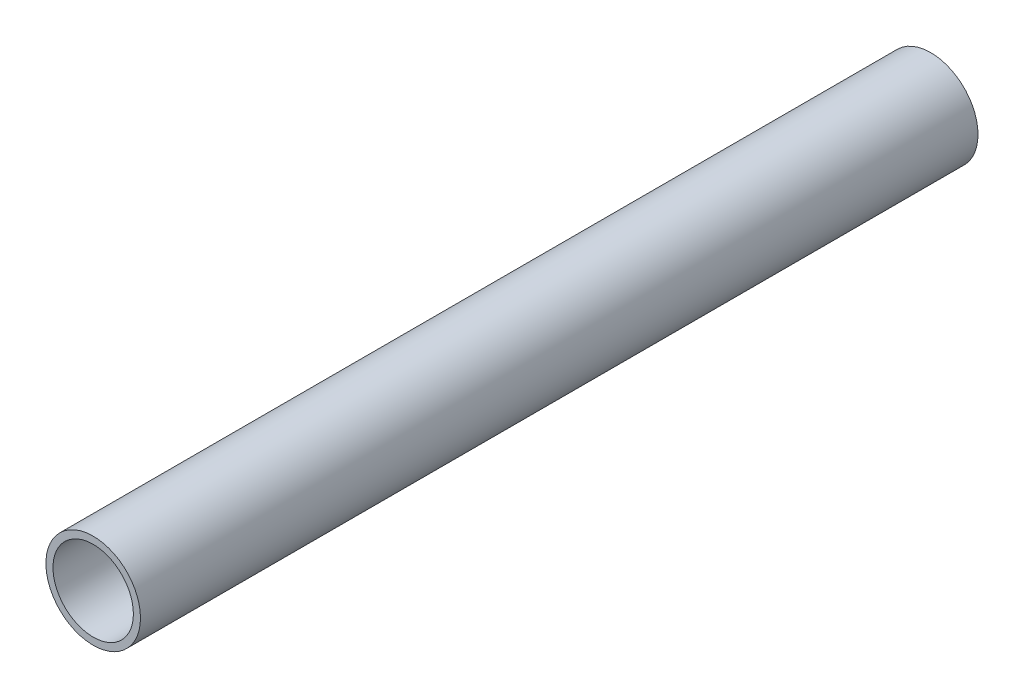
ISO-10303-21;
HEADER;
FILE_DESCRIPTION(('STEP AP214'),'2;1');
FILE_NAME('part.step','',(''),(''),'','','');
FILE_SCHEMA(('AUTOMOTIVE_DESIGN { 1 0 10303 214 1 1 1 1 }'));
ENDSEC;
DATA;
#1=APPLICATION_CONTEXT('core data for automotive mechanical design processes');
#2=APPLICATION_PROTOCOL_DEFINITION('international standard','automotive_design',2000,#1);
#3=PRODUCT_CONTEXT('',#1,'mechanical');
#4=PRODUCT('Part','Part','',(#3));
#5=PRODUCT_RELATED_PRODUCT_CATEGORY('part','',(#4));
#6=PRODUCT_DEFINITION_FORMATION('','',#4);
#7=PRODUCT_DEFINITION_CONTEXT('part definition',#1,'design');
#8=PRODUCT_DEFINITION('design','',#6,#7);
#9=PRODUCT_DEFINITION_SHAPE('','',#8);
#10=(LENGTH_UNIT() NAMED_UNIT(*) SI_UNIT(.MILLI.,.METRE.));
#11=(NAMED_UNIT(*) PLANE_ANGLE_UNIT() SI_UNIT($,.RADIAN.));
#12=(NAMED_UNIT(*) SI_UNIT($,.STERADIAN.) SOLID_ANGLE_UNIT());
#13=UNCERTAINTY_MEASURE_WITH_UNIT(LENGTH_MEASURE(1.E-05),#10,'distance_accuracy_value','');
#14=(GEOMETRIC_REPRESENTATION_CONTEXT(3) GLOBAL_UNCERTAINTY_ASSIGNED_CONTEXT((#13)) GLOBAL_UNIT_ASSIGNED_CONTEXT((#10,
#11,#12)) REPRESENTATION_CONTEXT('',''));
#15=CARTESIAN_POINT('',(0.,0.,0.));
#16=DIRECTION('',(0.,0.,1.));
#17=DIRECTION('',(1.,0.,0.));
#18=AXIS2_PLACEMENT_3D('',#15,#16,#17);
#19=CARTESIAN_POINT('',(0.,0.,225.));
#20=DIRECTION('',(0.,0.,1.));
#21=DIRECTION('',(1.,0.,0.));
#22=AXIS2_PLACEMENT_3D('',#19,#20,#21);
#23=PLANE('',#22);
#24=CARTESIAN_POINT('',(0.,0.,225.));
#25=DIRECTION('',(0.,0.,1.));
#26=DIRECTION('',(1.,0.,0.));
#27=AXIS2_PLACEMENT_3D('',#24,#25,#26);
#28=CIRCLE('',#27,12.7);
#29=CARTESIAN_POINT('',(12.7,0.,225.));
#30=VERTEX_POINT('',#29);
#31=EDGE_CURVE('E10',#30,#30,#28,.T.);
#32=ORIENTED_EDGE('',*,*,#31,.T.);
#33=EDGE_LOOP('',(#32));
#34=FACE_BOUND('',#33,.T.);
#35=CARTESIAN_POINT('',(0.,0.,225.));
#36=DIRECTION('',(0.,0.,1.));
#37=DIRECTION('',(1.,0.,0.));
#38=AXIS2_PLACEMENT_3D('',#35,#36,#37);
#39=CIRCLE('',#38,10.8);
#40=CARTESIAN_POINT('',(10.8,0.,225.));
#41=VERTEX_POINT('',#40);
#42=EDGE_CURVE('E43',#41,#41,#39,.T.);
#43=ORIENTED_EDGE('',*,*,#42,.F.);
#44=EDGE_LOOP('',(#43));
#45=FACE_BOUND('',#44,.T.);
#46=ADVANCED_FACE('F32',(#34,#45),#23,.T.);
#47=CARTESIAN_POINT('',(0.,0.,0.));
#48=DIRECTION('',(0.,0.,1.));
#49=DIRECTION('',(1.,0.,0.));
#50=AXIS2_PLACEMENT_3D('',#47,#48,#49);
#51=PLANE('',#50);
#52=CARTESIAN_POINT('',(0.,0.,0.));
#53=DIRECTION('',(0.,0.,1.));
#54=DIRECTION('',(1.,0.,0.));
#55=AXIS2_PLACEMENT_3D('',#52,#53,#54);
#56=CIRCLE('',#55,12.7);
#57=CARTESIAN_POINT('',(12.7,0.,0.));
#58=VERTEX_POINT('',#57);
#59=EDGE_CURVE('E36',#58,#58,#56,.T.);
#60=ORIENTED_EDGE('',*,*,#59,.F.);
#61=EDGE_LOOP('',(#60));
#62=FACE_BOUND('',#61,.T.);
#63=CARTESIAN_POINT('',(0.,0.,0.));
#64=DIRECTION('',(0.,0.,1.));
#65=DIRECTION('',(1.,0.,0.));
#66=AXIS2_PLACEMENT_3D('',#63,#64,#65);
#67=CIRCLE('',#66,10.8);
#68=CARTESIAN_POINT('',(10.8,0.,0.));
#69=VERTEX_POINT('',#68);
#70=EDGE_CURVE('E45',#69,#69,#67,.T.);
#71=ORIENTED_EDGE('',*,*,#70,.T.);
#72=EDGE_LOOP('',(#71));
#73=FACE_BOUND('',#72,.T.);
#74=ADVANCED_FACE('F55',(#62,#73),#51,.F.);
#75=CARTESIAN_POINT('',(0.,0.,225.));
#76=DIRECTION('',(0.,0.,-1.));
#77=DIRECTION('',(-1.,0.,0.));
#78=AXIS2_PLACEMENT_3D('',#75,#76,#77);
#79=CYLINDRICAL_SURFACE('',#78,12.7);
#80=ORIENTED_EDGE('',*,*,#31,.F.);
#81=EDGE_LOOP('',(#80));
#82=FACE_BOUND('',#81,.T.);
#83=ORIENTED_EDGE('',*,*,#59,.T.);
#84=EDGE_LOOP('',(#83));
#85=FACE_BOUND('',#84,.T.);
#86=ADVANCED_FACE('F34',(#82,#85),#79,.T.);
#87=CARTESIAN_POINT('',(0.,0.,225.));
#88=DIRECTION('',(0.,0.,-1.));
#89=DIRECTION('',(-1.,0.,0.));
#90=AXIS2_PLACEMENT_3D('',#87,#88,#89);
#91=CYLINDRICAL_SURFACE('',#90,10.8);
#92=ORIENTED_EDGE('',*,*,#42,.T.);
#93=EDGE_LOOP('',(#92));
#94=FACE_BOUND('',#93,.T.);
#95=ORIENTED_EDGE('',*,*,#70,.F.);
#96=EDGE_LOOP('',(#95));
#97=FACE_BOUND('',#96,.T.);
#98=ADVANCED_FACE('F51',(#94,#97),#91,.F.);
#99=CLOSED_SHELL('',(#46,#74,#86,#98));
#100=MANIFOLD_SOLID_BREP('B2',#99);
#101=ADVANCED_BREP_SHAPE_REPRESENTATION('',(#18,#100),#14);
#102=SHAPE_DEFINITION_REPRESENTATION(#9,#101);
ENDSEC;
END-ISO-10303-21;
